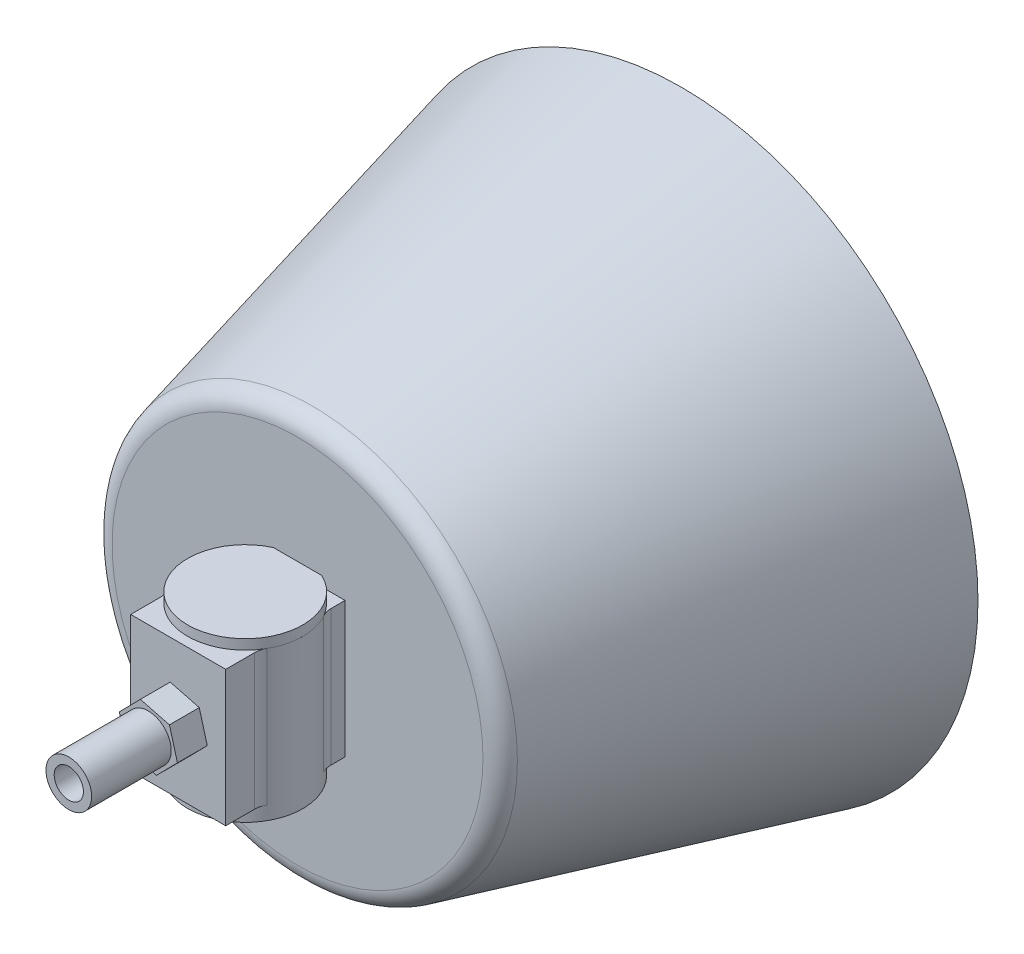
ISO-10303-21;
HEADER;
FILE_DESCRIPTION(('STEP AP214'),'2;1');
FILE_NAME('part.step','',(''),(''),'','','');
FILE_SCHEMA(('AUTOMOTIVE_DESIGN { 1 0 10303 214 1 1 1 1 }'));
ENDSEC;
DATA;
#1=APPLICATION_CONTEXT('core data for automotive mechanical design processes');
#2=APPLICATION_PROTOCOL_DEFINITION('international standard','automotive_design',2000,#1);
#3=PRODUCT_CONTEXT('',#1,'mechanical');
#4=PRODUCT('Part','Part','',(#3));
#5=PRODUCT_RELATED_PRODUCT_CATEGORY('part','',(#4));
#6=PRODUCT_DEFINITION_FORMATION('','',#4);
#7=PRODUCT_DEFINITION_CONTEXT('part definition',#1,'design');
#8=PRODUCT_DEFINITION('design','',#6,#7);
#9=PRODUCT_DEFINITION_SHAPE('','',#8);
#10=(LENGTH_UNIT() NAMED_UNIT(*) SI_UNIT(.MILLI.,.METRE.));
#11=(NAMED_UNIT(*) PLANE_ANGLE_UNIT() SI_UNIT($,.RADIAN.));
#12=(NAMED_UNIT(*) SI_UNIT($,.STERADIAN.) SOLID_ANGLE_UNIT());
#13=UNCERTAINTY_MEASURE_WITH_UNIT(LENGTH_MEASURE(1.E-05),#10,'distance_accuracy_value','');
#14=(GEOMETRIC_REPRESENTATION_CONTEXT(3) GLOBAL_UNCERTAINTY_ASSIGNED_CONTEXT((#13)) GLOBAL_UNIT_ASSIGNED_CONTEXT((#10,
#11,#12)) REPRESENTATION_CONTEXT('',''));
#15=CARTESIAN_POINT('',(0.,0.,0.));
#16=DIRECTION('',(0.,0.,1.));
#17=DIRECTION('',(1.,0.,0.));
#18=AXIS2_PLACEMENT_3D('',#15,#16,#17);
#19=CARTESIAN_POINT('',(0.,0.,15.24));
#20=DIRECTION('',(0.,0.,-1.));
#21=DIRECTION('',(-1.,0.,0.));
#22=AXIS2_PLACEMENT_3D('',#19,#20,#21);
#23=PLANE('',#22);
#24=DIRECTION('',(0.,1.,0.));
#25=VECTOR('',#24,1.);
#26=CARTESIAN_POINT('',(6.06977742119597,-8.6564533971476,15.24));
#27=LINE('',#26,#25);
#28=CARTESIAN_POINT('',(6.06977742119597,-8.6564533971476,15.24));
#29=VERTEX_POINT('',#28);
#30=CARTESIAN_POINT('',(6.06977742119597,8.6564533971476,15.24));
#31=VERTEX_POINT('',#30);
#32=EDGE_CURVE('E259',#29,#31,#27,.T.);
#33=ORIENTED_EDGE('',*,*,#32,.T.);
#34=DIRECTION('',(-1.,0.,0.));
#35=VECTOR('',#34,1.);
#36=CARTESIAN_POINT('',(-6.06977742119597,8.6564533971476,15.24));
#37=LINE('',#36,#35);
#38=CARTESIAN_POINT('',(-6.06977742119597,8.6564533971476,15.24));
#39=VERTEX_POINT('',#38);
#40=EDGE_CURVE('E262',#31,#39,#37,.T.);
#41=ORIENTED_EDGE('',*,*,#40,.T.);
#42=DIRECTION('',(0.,-1.,0.));
#43=VECTOR('',#42,1.);
#44=CARTESIAN_POINT('',(-6.06977742119597,-8.6564533971476,15.24));
#45=LINE('',#44,#43);
#46=CARTESIAN_POINT('',(-6.06977742119597,-8.6564533971476,15.24));
#47=VERTEX_POINT('',#46);
#48=EDGE_CURVE('E265',#39,#47,#45,.T.);
#49=ORIENTED_EDGE('',*,*,#48,.T.);
#50=DIRECTION('',(1.,0.,0.));
#51=VECTOR('',#50,1.);
#52=CARTESIAN_POINT('',(-6.06977742119597,-8.6564533971476,15.24));
#53=LINE('',#52,#51);
#54=EDGE_CURVE('E267',#47,#29,#53,.T.);
#55=ORIENTED_EDGE('',*,*,#54,.T.);
#56=EDGE_LOOP('',(#33,#41,#49,#55));
#57=FACE_BOUND('',#56,.T.);
#58=DIRECTION('',(0.96799318857098,-0.250976466785608,0.));
#59=VECTOR('',#58,1.);
#60=CARTESIAN_POINT('',(-2.68910813073288,-2.73308585679068,15.24));
#61=LINE('',#60,#59);
#62=CARTESIAN_POINT('',(-2.68910813073288,-2.73308585679068,15.24));
#63=VERTEX_POINT('',#62);
#64=CARTESIAN_POINT('',(1.02236771733825,-3.6953788831333,15.24));
#65=VERTEX_POINT('',#64);
#66=EDGE_CURVE('E216',#63,#65,#61,.T.);
#67=ORIENTED_EDGE('',*,*,#66,.F.);
#68=DIRECTION('',(0.266644598297093,-0.963794925385573,0.));
#69=VECTOR('',#68,1.);
#70=CARTESIAN_POINT('',(-3.71147584807113,0.962293026342617,15.24));
#71=LINE('',#70,#69);
#72=CARTESIAN_POINT('',(-3.71147584807113,0.962293026342617,15.24));
#73=VERTEX_POINT('',#72);
#74=EDGE_CURVE('E213',#73,#63,#71,.T.);
#75=ORIENTED_EDGE('',*,*,#74,.F.);
#76=DIRECTION('',(-0.701348590273887,-0.712818458599966,0.));
#77=VECTOR('',#76,1.);
#78=CARTESIAN_POINT('',(-1.02236771733825,3.6953788831333,15.24));
#79=LINE('',#78,#77);
#80=CARTESIAN_POINT('',(-1.02236771733825,3.6953788831333,15.24));
#81=VERTEX_POINT('',#80);
#82=EDGE_CURVE('E812',#81,#73,#79,.T.);
#83=ORIENTED_EDGE('',*,*,#82,.F.);
#84=DIRECTION('',(-0.96799318857098,0.250976466785607,0.));
#85=VECTOR('',#84,1.);
#86=CARTESIAN_POINT('',(2.68910813073288,2.73308585679069,15.24));
#87=LINE('',#86,#85);
#88=CARTESIAN_POINT('',(2.68910813073288,2.73308585679069,15.24));
#89=VERTEX_POINT('',#88);
#90=EDGE_CURVE('E827',#89,#81,#87,.T.);
#91=ORIENTED_EDGE('',*,*,#90,.F.);
#92=DIRECTION('',(-0.266644598297093,0.963794925385573,0.));
#93=VECTOR('',#92,1.);
#94=CARTESIAN_POINT('',(3.71147584807113,-0.962293026342616,15.24));
#95=LINE('',#94,#93);
#96=CARTESIAN_POINT('',(3.71147584807113,-0.962293026342616,15.24));
#97=VERTEX_POINT('',#96);
#98=EDGE_CURVE('E830',#97,#89,#95,.T.);
#99=ORIENTED_EDGE('',*,*,#98,.F.);
#100=DIRECTION('',(0.701348590273887,0.712818458599966,0.));
#101=VECTOR('',#100,1.);
#102=CARTESIAN_POINT('',(1.02236771733825,-3.6953788831333,15.24));
#103=LINE('',#102,#101);
#104=EDGE_CURVE('E831',#65,#97,#103,.T.);
#105=ORIENTED_EDGE('',*,*,#104,.F.);
#106=EDGE_LOOP('',(#67,#75,#83,#91,#99,#105));
#107=FACE_BOUND('',#106,.T.);
#108=ADVANCED_FACE('F32',(#57,#107),#23,.F.);
#109=CARTESIAN_POINT('',(0.,0.,0.));
#110=DIRECTION('',(0.,0.,1.));
#111=DIRECTION('',(1.,0.,0.));
#112=AXIS2_PLACEMENT_3D('',#109,#110,#111);
#113=PLANE('',#112);
#114=CARTESIAN_POINT('',(0.,0.,0.));
#115=DIRECTION('',(0.,0.,1.));
#116=DIRECTION('',(1.,0.,0.));
#117=AXIS2_PLACEMENT_3D('',#114,#115,#116);
#118=CIRCLE('',#117,23.6835282118406);
#119=CARTESIAN_POINT('',(23.6835282118406,0.,0.));
#120=VERTEX_POINT('',#119);
#121=EDGE_CURVE('E317',#120,#120,#118,.T.);
#122=ORIENTED_EDGE('',*,*,#121,.T.);
#123=EDGE_LOOP('',(#122));
#124=FACE_BOUND('',#123,.T.);
#125=DIRECTION('',(1.,0.,0.));
#126=VECTOR('',#125,1.);
#127=CARTESIAN_POINT('',(-6.06977742119597,-8.6564533971476,0.));
#128=LINE('',#127,#126);
#129=CARTESIAN_POINT('',(3.0674275777897,-8.6564533971476,0.));
#130=VERTEX_POINT('',#129);
#131=CARTESIAN_POINT('',(6.06977742119597,-8.6564533971476,0.));
#132=VERTEX_POINT('',#131);
#133=EDGE_CURVE('E279',#130,#132,#128,.T.);
#134=ORIENTED_EDGE('',*,*,#133,.F.);
#135=DIRECTION('',(0.,1.,0.));
#136=VECTOR('',#135,1.);
#137=CARTESIAN_POINT('',(3.0674275777897,-10.3935466028524,0.));
#138=LINE('',#137,#136);
#139=CARTESIAN_POINT('',(3.0674275777897,-10.3935466028524,0.));
#140=VERTEX_POINT('',#139);
#141=EDGE_CURVE('E240',#130,#140,#138,.F.);
#142=ORIENTED_EDGE('',*,*,#141,.T.);
#143=DIRECTION('',(1.,0.,0.));
#144=VECTOR('',#143,1.);
#145=CARTESIAN_POINT('',(0.,-10.3935466028524,0.));
#146=LINE('',#145,#144);
#147=CARTESIAN_POINT('',(-3.04606878534649,-10.3935466028524,0.));
#148=VERTEX_POINT('',#147);
#149=EDGE_CURVE('E305',#148,#140,#146,.T.);
#150=ORIENTED_EDGE('',*,*,#149,.F.);
#151=DIRECTION('',(0.,1.,0.));
#152=VECTOR('',#151,1.);
#153=CARTESIAN_POINT('',(-3.04606878534649,-10.3935466028524,0.));
#154=LINE('',#153,#152);
#155=CARTESIAN_POINT('',(-3.04606878534649,-8.6564533971476,0.));
#156=VERTEX_POINT('',#155);
#157=EDGE_CURVE('E242',#148,#156,#154,.T.);
#158=ORIENTED_EDGE('',*,*,#157,.T.);
#159=CARTESIAN_POINT('',(-6.06977742119597,-8.6564533971476,0.));
#160=VERTEX_POINT('',#159);
#161=EDGE_CURVE('E263',#160,#156,#128,.T.);
#162=ORIENTED_EDGE('',*,*,#161,.F.);
#163=DIRECTION('',(0.,-1.,0.));
#164=VECTOR('',#163,1.);
#165=CARTESIAN_POINT('',(-6.06977742119597,-8.6564533971476,0.));
#166=LINE('',#165,#164);
#167=CARTESIAN_POINT('',(-6.06977742119597,8.6564533971476,0.));
#168=VERTEX_POINT('',#167);
#169=EDGE_CURVE('E276',#168,#160,#166,.T.);
#170=ORIENTED_EDGE('',*,*,#169,.F.);
#171=DIRECTION('',(-1.,0.,0.));
#172=VECTOR('',#171,1.);
#173=CARTESIAN_POINT('',(-6.06977742119597,8.6564533971476,0.));
#174=LINE('',#173,#172);
#175=CARTESIAN_POINT('',(-3.07819517740352,8.6564533971476,0.));
#176=VERTEX_POINT('',#175);
#177=EDGE_CURVE('E272',#176,#168,#174,.T.);
#178=ORIENTED_EDGE('',*,*,#177,.F.);
#179=DIRECTION('',(0.,-1.,0.));
#180=VECTOR('',#179,1.);
#181=CARTESIAN_POINT('',(-3.07819517740352,9.9264533971476,0.));
#182=LINE('',#181,#180);
#183=CARTESIAN_POINT('',(-3.07819517740352,9.9264533971476,0.));
#184=VERTEX_POINT('',#183);
#185=EDGE_CURVE('E255',#176,#184,#182,.F.);
#186=ORIENTED_EDGE('',*,*,#185,.T.);
#187=DIRECTION('',(-1.,0.,0.));
#188=VECTOR('',#187,1.);
#189=CARTESIAN_POINT('',(0.,9.9264533971476,0.));
#190=LINE('',#189,#188);
#191=CARTESIAN_POINT('',(3.07819517740352,9.9264533971476,0.));
#192=VERTEX_POINT('',#191);
#193=EDGE_CURVE('E303',#192,#184,#190,.T.);
#194=ORIENTED_EDGE('',*,*,#193,.F.);
#195=DIRECTION('',(0.,-1.,0.));
#196=VECTOR('',#195,1.);
#197=CARTESIAN_POINT('',(3.07819517740352,9.9264533971476,0.));
#198=LINE('',#197,#196);
#199=CARTESIAN_POINT('',(3.07819517740352,8.6564533971476,0.));
#200=VERTEX_POINT('',#199);
#201=EDGE_CURVE('E247',#192,#200,#198,.T.);
#202=ORIENTED_EDGE('',*,*,#201,.T.);
#203=CARTESIAN_POINT('',(6.06977742119597,8.6564533971476,0.));
#204=VERTEX_POINT('',#203);
#205=EDGE_CURVE('E273',#204,#200,#174,.T.);
#206=ORIENTED_EDGE('',*,*,#205,.F.);
#207=DIRECTION('',(0.,1.,0.));
#208=VECTOR('',#207,1.);
#209=CARTESIAN_POINT('',(6.06977742119597,-8.6564533971476,0.));
#210=LINE('',#209,#208);
#211=EDGE_CURVE('E258',#132,#204,#210,.T.);
#212=ORIENTED_EDGE('',*,*,#211,.F.);
#213=EDGE_LOOP('',(#134,#142,#150,#158,#162,#170,#178,#186,#194,#202,#206,#212));
#214=FACE_BOUND('',#213,.T.);
#215=ADVANCED_FACE('F387',(#124,#214),#113,.T.);
#216=CARTESIAN_POINT('',(6.06977742119597,-8.6564533971476,15.24));
#217=DIRECTION('',(-1.,0.,0.));
#218=DIRECTION('',(0.,0.,1.));
#219=AXIS2_PLACEMENT_3D('',#216,#217,#218);
#220=PLANE('',#219);
#221=DIRECTION('',(0.,0.,-1.));
#222=VECTOR('',#221,1.);
#223=CARTESIAN_POINT('',(6.06977742119597,-8.6564533971476,15.24));
#224=LINE('',#223,#222);
#225=CARTESIAN_POINT('',(6.06977742119597,-8.6564533971476,11.5507942324968));
#226=VERTEX_POINT('',#225);
#227=EDGE_CURVE('E282',#29,#226,#224,.T.);
#228=ORIENTED_EDGE('',*,*,#227,.T.);
#229=DIRECTION('',(0.,-1.,0.));
#230=VECTOR('',#229,1.);
#231=CARTESIAN_POINT('',(6.06977742119597,8.65645339714759,11.5507942324968));
#232=LINE('',#231,#230);
#233=CARTESIAN_POINT('',(6.06977742119597,8.6564533971476,11.5507942324968));
#234=VERTEX_POINT('',#233);
#235=EDGE_CURVE('E337',#226,#234,#232,.F.);
#236=ORIENTED_EDGE('',*,*,#235,.T.);
#237=DIRECTION('',(0.,0.,-1.));
#238=VECTOR('',#237,1.);
#239=CARTESIAN_POINT('',(6.06977742119597,8.6564533971476,15.24));
#240=LINE('',#239,#238);
#241=EDGE_CURVE('E294',#31,#234,#240,.T.);
#242=ORIENTED_EDGE('',*,*,#241,.F.);
#243=ORIENTED_EDGE('',*,*,#32,.F.);
#244=EDGE_LOOP('',(#228,#236,#242,#243));
#245=FACE_BOUND('',#244,.T.);
#246=ADVANCED_FACE('F393',(#245),#220,.F.);
#247=CARTESIAN_POINT('',(6.06977742119597,8.6564533971476,1.80436508766875));
#248=VERTEX_POINT('',#247);
#249=EDGE_CURVE('E293',#248,#204,#240,.T.);
#250=ORIENTED_EDGE('',*,*,#249,.F.);
#251=DIRECTION('',(0.,-1.,0.));
#252=VECTOR('',#251,1.);
#253=CARTESIAN_POINT('',(6.06977742119597,-8.6564533971476,1.80436508766875));
#254=LINE('',#253,#252);
#255=CARTESIAN_POINT('',(6.06977742119597,-8.6564533971476,1.80436508766875));
#256=VERTEX_POINT('',#255);
#257=EDGE_CURVE('E335',#248,#256,#254,.T.);
#258=ORIENTED_EDGE('',*,*,#257,.T.);
#259=EDGE_CURVE('E269',#256,#132,#224,.T.);
#260=ORIENTED_EDGE('',*,*,#259,.T.);
#261=ORIENTED_EDGE('',*,*,#211,.T.);
#262=EDGE_LOOP('',(#250,#258,#260,#261));
#263=FACE_BOUND('',#262,.T.);
#264=ADVANCED_FACE('F413',(#263),#220,.F.);
#265=CARTESIAN_POINT('',(-6.06977742119597,-8.6564533971476,15.24));
#266=DIRECTION('',(1.,0.,0.));
#267=DIRECTION('',(0.,0.,-1.));
#268=AXIS2_PLACEMENT_3D('',#265,#266,#267);
#269=PLANE('',#268);
#270=DIRECTION('',(0.,0.,-1.));
#271=VECTOR('',#270,1.);
#272=CARTESIAN_POINT('',(-6.06977742119597,-8.6564533971476,15.24));
#273=LINE('',#272,#271);
#274=CARTESIAN_POINT('',(-6.06977742119597,-8.6564533971476,1.84224809224326));
#275=VERTEX_POINT('',#274);
#276=EDGE_CURVE('E285',#275,#160,#273,.T.);
#277=ORIENTED_EDGE('',*,*,#276,.F.);
#278=DIRECTION('',(0.,-1.,0.));
#279=VECTOR('',#278,1.);
#280=CARTESIAN_POINT('',(-6.06977742119597,8.65645339714759,1.84224809224326));
#281=LINE('',#280,#279);
#282=CARTESIAN_POINT('',(-6.06977742119597,8.6564533971476,1.84224809224326));
#283=VERTEX_POINT('',#282);
#284=EDGE_CURVE('E341',#275,#283,#281,.F.);
#285=ORIENTED_EDGE('',*,*,#284,.T.);
#286=DIRECTION('',(0.,0.,-1.));
#287=VECTOR('',#286,1.);
#288=CARTESIAN_POINT('',(-6.06977742119597,8.6564533971476,15.24));
#289=LINE('',#288,#287);
#290=EDGE_CURVE('E289',#283,#168,#289,.T.);
#291=ORIENTED_EDGE('',*,*,#290,.T.);
#292=ORIENTED_EDGE('',*,*,#169,.T.);
#293=EDGE_LOOP('',(#277,#285,#291,#292));
#294=FACE_BOUND('',#293,.T.);
#295=ADVANCED_FACE('F409',(#294),#269,.F.);
#296=CARTESIAN_POINT('',(-6.06977742119597,8.6564533971476,11.5129112279223));
#297=VERTEX_POINT('',#296);
#298=EDGE_CURVE('E290',#39,#297,#289,.T.);
#299=ORIENTED_EDGE('',*,*,#298,.T.);
#300=DIRECTION('',(0.,-1.,0.));
#301=VECTOR('',#300,1.);
#302=CARTESIAN_POINT('',(-6.06977742119597,-8.6564533971476,11.5129112279223));
#303=LINE('',#302,#301);
#304=CARTESIAN_POINT('',(-6.06977742119597,-8.6564533971476,11.5129112279223));
#305=VERTEX_POINT('',#304);
#306=EDGE_CURVE('E348',#297,#305,#303,.T.);
#307=ORIENTED_EDGE('',*,*,#306,.T.);
#308=EDGE_CURVE('E286',#47,#305,#273,.T.);
#309=ORIENTED_EDGE('',*,*,#308,.F.);
#310=ORIENTED_EDGE('',*,*,#48,.F.);
#311=EDGE_LOOP('',(#299,#307,#309,#310));
#312=FACE_BOUND('',#311,.T.);
#313=ADVANCED_FACE('F412',(#312),#269,.F.);
#314=CARTESIAN_POINT('',(-6.06977742119597,-8.6564533971476,15.24));
#315=DIRECTION('',(0.,1.,0.));
#316=DIRECTION('',(0.,0.,1.));
#317=AXIS2_PLACEMENT_3D('',#314,#315,#316);
#318=PLANE('',#317);
#319=CARTESIAN_POINT('',(0.0106793962216019,-8.6564533971476,6.67757966008276));
#320=DIRECTION('',(0.,1.,0.));
#321=DIRECTION('',(0.,0.,1.));
#322=AXIS2_PLACEMENT_3D('',#319,#320,#321);
#323=CIRCLE('',#322,7.34396211606997);
#324=CARTESIAN_POINT('',(-6.39447549479129,-8.6564533971476,3.0848410967575));
#325=VERTEX_POINT('',#324);
#326=EDGE_CURVE('E239',#325,#156,#323,.F.);
#327=ORIENTED_EDGE('',*,*,#326,.F.);
#328=CARTESIAN_POINT('',(-8.60977742119597,-8.6564533971476,1.84224809224326));
#329=DIRECTION('',(0.,1.,0.));
#330=DIRECTION('',(0.,0.,1.));
#331=AXIS2_PLACEMENT_3D('',#328,#329,#330);
#332=CIRCLE('',#331,2.54);
#333=EDGE_CURVE('E360',#325,#275,#332,.T.);
#334=ORIENTED_EDGE('',*,*,#333,.T.);
#335=ORIENTED_EDGE('',*,*,#276,.T.);
#336=ORIENTED_EDGE('',*,*,#161,.T.);
#337=EDGE_LOOP('',(#327,#334,#335,#336));
#338=FACE_BOUND('',#337,.T.);
#339=ADVANCED_FACE('F407',(#338),#318,.F.);
#340=CARTESIAN_POINT('',(6.39996431922917,-8.6564533971476,3.05669334111346));
#341=VERTEX_POINT('',#340);
#342=EDGE_CURVE('E238',#130,#341,#323,.F.);
#343=ORIENTED_EDGE('',*,*,#342,.F.);
#344=ORIENTED_EDGE('',*,*,#133,.T.);
#345=ORIENTED_EDGE('',*,*,#259,.F.);
#346=CARTESIAN_POINT('',(8.60977742119597,-8.6564533971476,1.80436508766875));
#347=DIRECTION('',(0.,1.,0.));
#348=DIRECTION('',(0.,0.,1.));
#349=AXIS2_PLACEMENT_3D('',#346,#347,#348);
#350=CIRCLE('',#349,2.54);
#351=EDGE_CURVE('E352',#256,#341,#350,.T.);
#352=ORIENTED_EDGE('',*,*,#351,.T.);
#353=EDGE_LOOP('',(#343,#344,#345,#352));
#354=FACE_BOUND('',#353,.T.);
#355=ADVANCED_FACE('F408',(#354),#318,.F.);
#356=CARTESIAN_POINT('',(0.,8.6564533971476,6.67971339190476));
#357=DIRECTION('',(0.,1.,0.));
#358=DIRECTION('',(0.,0.,1.));
#359=AXIS2_PLACEMENT_3D('',#356,#357,#358);
#360=PLANE('',#359);
#361=CARTESIAN_POINT('',(0.0106793962216019,8.6564533971476,6.67757966008276));
#362=DIRECTION('',(0.,-1.,0.));
#363=DIRECTION('',(0.,0.,-1.));
#364=AXIS2_PLACEMENT_3D('',#361,#362,#363);
#365=CIRCLE('',#364,7.34396211606997);
#366=CARTESIAN_POINT('',(6.39996431922917,8.6564533971476,3.05669334111346));
#367=VERTEX_POINT('',#366);
#368=CARTESIAN_POINT('',(7.21230507816637,8.6564533971476,5.23870263287561));
#369=VERTEX_POINT('',#368);
#370=EDGE_CURVE('E233',#367,#369,#365,.T.);
#371=ORIENTED_EDGE('',*,*,#370,.F.);
#372=CARTESIAN_POINT('',(8.60977742119597,8.6564533971476,1.80436508766875));
#373=DIRECTION('',(0.,1.,0.));
#374=DIRECTION('',(0.,0.,1.));
#375=AXIS2_PLACEMENT_3D('',#372,#373,#374);
#376=CIRCLE('',#375,2.54);
#377=CARTESIAN_POINT('',(6.37749897672294,8.6564533971476,3.01619549921201));
#378=VERTEX_POINT('',#377);
#379=EDGE_CURVE('E332',#367,#378,#376,.F.);
#380=ORIENTED_EDGE('',*,*,#379,.T.);
#381=CARTESIAN_POINT('',(0.,8.6564533971476,6.67971339190476));
#382=DIRECTION('',(0.,1.,0.));
#383=DIRECTION('',(0.,0.,1.));
#384=AXIS2_PLACEMENT_3D('',#381,#382,#383);
#385=CIRCLE('',#384,7.35485258507484);
#386=EDGE_CURVE('E250',#369,#378,#385,.T.);
#387=ORIENTED_EDGE('',*,*,#386,.F.);
#388=EDGE_LOOP('',(#371,#380,#387));
#389=FACE_BOUND('',#388,.T.);
#390=ADVANCED_FACE('F505',(#389),#360,.F.);
#391=CARTESIAN_POINT('',(-6.06977742119597,8.6564533971476,15.24));
#392=DIRECTION('',(0.,-1.,0.));
#393=DIRECTION('',(0.,0.,-1.));
#394=AXIS2_PLACEMENT_3D('',#391,#392,#393);
#395=PLANE('',#394);
#396=CARTESIAN_POINT('',(-6.27618594874521,8.6564533971476,2.84521909865626));
#397=VERTEX_POINT('',#396);
#398=EDGE_CURVE('E506',#176,#397,#385,.T.);
#399=ORIENTED_EDGE('',*,*,#398,.F.);
#400=ORIENTED_EDGE('',*,*,#177,.T.);
#401=ORIENTED_EDGE('',*,*,#290,.F.);
#402=CARTESIAN_POINT('',(-8.60977742119597,8.6564533971476,1.84224809224326));
#403=DIRECTION('',(0.,-1.,0.));
#404=DIRECTION('',(0.,0.,-1.));
#405=AXIS2_PLACEMENT_3D('',#402,#403,#404);
#406=CIRCLE('',#405,2.54);
#407=EDGE_CURVE('E362',#283,#397,#406,.T.);
#408=ORIENTED_EDGE('',*,*,#407,.T.);
#409=EDGE_LOOP('',(#399,#400,#401,#408));
#410=FACE_BOUND('',#409,.T.);
#411=ADVANCED_FACE('F419',(#410),#395,.F.);
#412=CARTESIAN_POINT('',(-6.27019404083715,8.6564533971476,10.5239978816938));
#413=VERTEX_POINT('',#412);
#414=CARTESIAN_POINT('',(6.35153846793674,8.6564533971476,10.3880574480169));
#415=VERTEX_POINT('',#414);
#416=EDGE_CURVE('E48',#413,#415,#385,.T.);
#417=ORIENTED_EDGE('',*,*,#416,.F.);
#418=CARTESIAN_POINT('',(-8.60977742119597,8.6564533971476,11.5129112279223));
#419=DIRECTION('',(0.,-1.,0.));
#420=DIRECTION('',(0.,0.,-1.));
#421=AXIS2_PLACEMENT_3D('',#418,#419,#420);
#422=CIRCLE('',#421,2.54);
#423=EDGE_CURVE('E365',#413,#297,#422,.T.);
#424=ORIENTED_EDGE('',*,*,#423,.T.);
#425=ORIENTED_EDGE('',*,*,#298,.F.);
#426=ORIENTED_EDGE('',*,*,#40,.F.);
#427=ORIENTED_EDGE('',*,*,#241,.T.);
#428=CARTESIAN_POINT('',(8.60977742119597,8.6564533971476,11.5507942324968));
#429=DIRECTION('',(0.,-1.,0.));
#430=DIRECTION('',(0.,0.,-1.));
#431=AXIS2_PLACEMENT_3D('',#428,#429,#430);
#432=CIRCLE('',#431,2.54);
#433=EDGE_CURVE('E357',#234,#415,#432,.T.);
#434=ORIENTED_EDGE('',*,*,#433,.T.);
#435=EDGE_LOOP('',(#417,#424,#425,#426,#427,#434));
#436=FACE_BOUND('',#435,.T.);
#437=ADVANCED_FACE('F420',(#436),#395,.F.);
#438=CARTESIAN_POINT('',(0.,0.,-49.0231349771042));
#439=DIRECTION('',(0.,0.,-1.));
#440=DIRECTION('',(-1.,0.,0.));
#441=AXIS2_PLACEMENT_3D('',#438,#439,#440);
#442=CONICAL_SURFACE('',#441,37.87194976772,0.2439685624603);
#443=CARTESIAN_POINT('',(0.,0.,-1.92644887788709));
#444=DIRECTION('',(0.,0.,1.));
#445=DIRECTION('',(1.,0.,0.));
#446=AXIS2_PLACEMENT_3D('',#443,#444,#445);
#447=CIRCLE('',#446,26.1483111679149);
#448=CARTESIAN_POINT('',(26.1483111679149,0.,-1.92644887788709));
#449=VERTEX_POINT('',#448);
#450=EDGE_CURVE('E314',#449,#449,#447,.F.);
#451=ORIENTED_EDGE('',*,*,#450,.T.);
#452=EDGE_LOOP('',(#451));
#453=FACE_BOUND('',#452,.T.);
#454=CARTESIAN_POINT('',(0.,0.,-49.0231349771042));
#455=DIRECTION('',(0.,0.,-1.));
#456=DIRECTION('',(-1.,0.,0.));
#457=AXIS2_PLACEMENT_3D('',#454,#455,#456);
#458=CIRCLE('',#457,37.87194976772);
#459=CARTESIAN_POINT('',(-37.87194976772,0.,-49.0231349771042));
#460=VERTEX_POINT('',#459);
#461=EDGE_CURVE('E300',#460,#460,#458,.T.);
#462=ORIENTED_EDGE('',*,*,#461,.F.);
#463=EDGE_LOOP('',(#462));
#464=FACE_BOUND('',#463,.T.);
#465=ADVANCED_FACE('F434',(#453,#464),#442,.T.);
#466=CARTESIAN_POINT('',(-37.87194976772,0.,-49.0231349771042));
#467=DIRECTION('',(0.,0.,-1.));
#468=DIRECTION('',(-1.,0.,0.));
#469=AXIS2_PLACEMENT_3D('',#466,#467,#468);
#470=PLANE('',#469);
#471=ORIENTED_EDGE('',*,*,#461,.T.);
#472=EDGE_LOOP('',(#471));
#473=FACE_BOUND('',#472,.T.);
#474=CARTESIAN_POINT('',(0.,0.,-49.0231349771042));
#475=DIRECTION('',(0.,0.,-1.));
#476=DIRECTION('',(-1.,0.,0.));
#477=AXIS2_PLACEMENT_3D('',#474,#475,#476);
#478=CIRCLE('',#477,35.3744655715437);
#479=CARTESIAN_POINT('',(-35.3744655715437,0.,-49.0231349771042));
#480=VERTEX_POINT('',#479);
#481=EDGE_CURVE('E297',#480,#480,#478,.T.);
#482=ORIENTED_EDGE('',*,*,#481,.F.);
#483=EDGE_LOOP('',(#482));
#484=FACE_BOUND('',#483,.T.);
#485=ADVANCED_FACE('F430',(#473,#484),#470,.T.);
#486=CARTESIAN_POINT('',(0.,0.,-3.22703553323876));
#487=DIRECTION('',(0.,0.,-1.));
#488=DIRECTION('',(-1.,0.,0.));
#489=AXIS2_PLACEMENT_3D('',#486,#487,#488);
#490=CONICAL_SURFACE('',#489,23.9745781563325,0.2439685624603);
#491=CARTESIAN_POINT('',(0.,0.,-7.07993328901297));
#492=DIRECTION('',(0.,0.,-1.));
#493=DIRECTION('',(-1.,0.,0.));
#494=AXIS2_PLACEMENT_3D('',#491,#492,#493);
#495=CIRCLE('',#494,24.9336685848085);
#496=CARTESIAN_POINT('',(-24.9336685848085,0.,-7.07993328901297));
#497=VERTEX_POINT('',#496);
#498=EDGE_CURVE('E311',#497,#497,#495,.F.);
#499=ORIENTED_EDGE('',*,*,#498,.T.);
#500=EDGE_LOOP('',(#499));
#501=FACE_BOUND('',#500,.T.);
#502=ORIENTED_EDGE('',*,*,#481,.T.);
#503=EDGE_LOOP('',(#502));
#504=FACE_BOUND('',#503,.T.);
#505=ADVANCED_FACE('F426',(#501,#504),#490,.F.);
#506=CARTESIAN_POINT('',(-23.9745781563325,0.,-3.22703553323876));
#507=DIRECTION('',(0.,0.,-1.));
#508=DIRECTION('',(-1.,0.,0.));
#509=AXIS2_PLACEMENT_3D('',#506,#507,#508);
#510=PLANE('',#509);
#511=CARTESIAN_POINT('',(0.,0.,-3.22703553323876));
#512=DIRECTION('',(0.,0.,-1.));
#513=DIRECTION('',(-1.,0.,0.));
#514=AXIS2_PLACEMENT_3D('',#511,#512,#513);
#515=CIRCLE('',#514,4.40660403766936);
#516=CARTESIAN_POINT('',(-4.40660403766936,0.,-3.22703553323876));
#517=VERTEX_POINT('',#516);
#518=EDGE_CURVE('E11',#517,#517,#515,.F.);
#519=ORIENTED_EDGE('',*,*,#518,.T.);
#520=EDGE_LOOP('',(#519));
#521=FACE_BOUND('',#520,.T.);
#522=CARTESIAN_POINT('',(0.,0.,-3.22703553323876));
#523=DIRECTION('',(0.,0.,-1.));
#524=DIRECTION('',(-1.,0.,0.));
#525=AXIS2_PLACEMENT_3D('',#522,#523,#524);
#526=CIRCLE('',#525,20.00410267266);
#527=CARTESIAN_POINT('',(-20.00410267266,0.,-3.22703553323876));
#528=VERTEX_POINT('',#527);
#529=EDGE_CURVE('E308',#528,#528,#526,.T.);
#530=ORIENTED_EDGE('',*,*,#529,.T.);
#531=EDGE_LOOP('',(#530));
#532=FACE_BOUND('',#531,.T.);
#533=ADVANCED_FACE('F417',(#521,#532),#510,.T.);
#534=EDGE_CURVE('E252',#378,#200,#385,.T.);
#535=ORIENTED_EDGE('',*,*,#534,.F.);
#536=CARTESIAN_POINT('',(8.60977742119597,8.6564533971476,1.80436508766875));
#537=DIRECTION('',(0.,-1.,0.));
#538=DIRECTION('',(0.,0.,-1.));
#539=AXIS2_PLACEMENT_3D('',#536,#537,#538);
#540=CIRCLE('',#539,2.54);
#541=EDGE_CURVE('E350',#378,#248,#540,.T.);
#542=ORIENTED_EDGE('',*,*,#541,.T.);
#543=ORIENTED_EDGE('',*,*,#249,.T.);
#544=ORIENTED_EDGE('',*,*,#205,.T.);
#545=EDGE_LOOP('',(#535,#542,#543,#544));
#546=FACE_BOUND('',#545,.T.);
#547=ADVANCED_FACE('F405',(#546),#395,.F.);
#548=CARTESIAN_POINT('',(6.39996431922917,-8.6564533971476,10.2984659790521));
#549=VERTEX_POINT('',#548);
#550=CARTESIAN_POINT('',(-6.39447549479129,-8.6564533971476,10.270318223408));
#551=VERTEX_POINT('',#550);
#552=EDGE_CURVE('E232',#549,#551,#323,.F.);
#553=ORIENTED_EDGE('',*,*,#552,.F.);
#554=CARTESIAN_POINT('',(8.60977742119597,-8.6564533971476,11.5507942324968));
#555=DIRECTION('',(0.,1.,0.));
#556=DIRECTION('',(0.,0.,1.));
#557=AXIS2_PLACEMENT_3D('',#554,#555,#556);
#558=CIRCLE('',#557,2.54);
#559=EDGE_CURVE('E355',#549,#226,#558,.T.);
#560=ORIENTED_EDGE('',*,*,#559,.T.);
#561=ORIENTED_EDGE('',*,*,#227,.F.);
#562=ORIENTED_EDGE('',*,*,#54,.F.);
#563=ORIENTED_EDGE('',*,*,#308,.T.);
#564=CARTESIAN_POINT('',(-8.60977742119597,-8.6564533971476,11.5129112279223));
#565=DIRECTION('',(0.,1.,0.));
#566=DIRECTION('',(0.,0.,1.));
#567=AXIS2_PLACEMENT_3D('',#564,#565,#566);
#568=CIRCLE('',#567,2.54);
#569=EDGE_CURVE('E367',#305,#551,#568,.T.);
#570=ORIENTED_EDGE('',*,*,#569,.T.);
#571=EDGE_LOOP('',(#553,#560,#561,#562,#563,#570));
#572=FACE_BOUND('',#571,.T.);
#573=ADVANCED_FACE('F401',(#572),#318,.F.);
#574=EDGE_CURVE('E248',#415,#369,#385,.T.);
#575=ORIENTED_EDGE('',*,*,#574,.F.);
#576=CARTESIAN_POINT('',(8.60977742119597,8.6564533971476,11.5507942324968));
#577=DIRECTION('',(0.,1.,0.));
#578=DIRECTION('',(0.,0.,1.));
#579=AXIS2_PLACEMENT_3D('',#576,#577,#578);
#580=CIRCLE('',#579,2.54);
#581=CARTESIAN_POINT('',(6.39996431922917,8.6564533971476,10.2984659790521));
#582=VERTEX_POINT('',#581);
#583=EDGE_CURVE('E339',#415,#582,#580,.F.);
#584=ORIENTED_EDGE('',*,*,#583,.T.);
#585=EDGE_CURVE('E236',#369,#582,#365,.T.);
#586=ORIENTED_EDGE('',*,*,#585,.F.);
#587=EDGE_LOOP('',(#575,#584,#586));
#588=FACE_BOUND('',#587,.T.);
#589=ADVANCED_FACE('F404',(#588),#360,.F.);
#590=EDGE_CURVE('E251',#397,#413,#385,.T.);
#591=ORIENTED_EDGE('',*,*,#590,.F.);
#592=CARTESIAN_POINT('',(-8.60977742119597,8.6564533971476,1.84224809224326));
#593=DIRECTION('',(0.,1.,0.));
#594=DIRECTION('',(0.,0.,1.));
#595=AXIS2_PLACEMENT_3D('',#592,#593,#594);
#596=CIRCLE('',#595,2.54);
#597=CARTESIAN_POINT('',(-6.39447549479129,8.6564533971476,3.0848410967575));
#598=VERTEX_POINT('',#597);
#599=EDGE_CURVE('E346',#397,#598,#596,.F.);
#600=ORIENTED_EDGE('',*,*,#599,.T.);
#601=CARTESIAN_POINT('',(-6.39447549479129,8.6564533971476,10.270318223408));
#602=VERTEX_POINT('',#601);
#603=EDGE_CURVE('E228',#602,#598,#365,.T.);
#604=ORIENTED_EDGE('',*,*,#603,.F.);
#605=CARTESIAN_POINT('',(-8.60977742119597,8.6564533971476,11.5129112279223));
#606=DIRECTION('',(0.,1.,0.));
#607=DIRECTION('',(0.,0.,1.));
#608=AXIS2_PLACEMENT_3D('',#605,#606,#607);
#609=CIRCLE('',#608,2.54);
#610=EDGE_CURVE('E343',#602,#413,#609,.F.);
#611=ORIENTED_EDGE('',*,*,#610,.T.);
#612=EDGE_LOOP('',(#591,#600,#604,#611));
#613=FACE_BOUND('',#612,.T.);
#614=ADVANCED_FACE('F482',(#613),#360,.F.);
#615=CARTESIAN_POINT('',(0.,9.9264533971476,6.67971339190476));
#616=DIRECTION('',(0.,-1.,0.));
#617=DIRECTION('',(0.,0.,-1.));
#618=AXIS2_PLACEMENT_3D('',#615,#616,#617);
#619=CYLINDRICAL_SURFACE('',#618,7.35485258507484);
#620=ORIENTED_EDGE('',*,*,#185,.F.);
#621=ORIENTED_EDGE('',*,*,#398,.T.);
#622=ORIENTED_EDGE('',*,*,#590,.T.);
#623=ORIENTED_EDGE('',*,*,#416,.T.);
#624=ORIENTED_EDGE('',*,*,#574,.T.);
#625=ORIENTED_EDGE('',*,*,#386,.T.);
#626=ORIENTED_EDGE('',*,*,#534,.T.);
#627=ORIENTED_EDGE('',*,*,#201,.F.);
#628=CARTESIAN_POINT('',(0.,9.9264533971476,6.67971339190476));
#629=DIRECTION('',(0.,1.,0.));
#630=DIRECTION('',(0.,0.,1.));
#631=AXIS2_PLACEMENT_3D('',#628,#629,#630);
#632=CIRCLE('',#631,7.35485258507484);
#633=EDGE_CURVE('E244',#184,#192,#632,.T.);
#634=ORIENTED_EDGE('',*,*,#633,.F.);
#635=EDGE_LOOP('',(#620,#621,#622,#623,#624,#625,#626,#627,#634));
#636=FACE_BOUND('',#635,.T.);
#637=ADVANCED_FACE('F399',(#636),#619,.T.);
#638=CARTESIAN_POINT('',(0.,9.9264533971476,6.67971339190476));
#639=DIRECTION('',(0.,1.,0.));
#640=DIRECTION('',(0.,0.,1.));
#641=AXIS2_PLACEMENT_3D('',#638,#639,#640);
#642=PLANE('',#641);
#643=ORIENTED_EDGE('',*,*,#633,.T.);
#644=ORIENTED_EDGE('',*,*,#193,.T.);
#645=EDGE_LOOP('',(#643,#644));
#646=FACE_BOUND('',#645,.T.);
#647=ADVANCED_FACE('F523',(#646),#642,.T.);
#648=CARTESIAN_POINT('',(0.0106793962216019,-10.3935466028524,6.67757966008276));
#649=DIRECTION('',(0.,1.,0.));
#650=DIRECTION('',(0.,0.,1.));
#651=AXIS2_PLACEMENT_3D('',#648,#649,#650);
#652=CYLINDRICAL_SURFACE('',#651,7.34396211606997);
#653=ORIENTED_EDGE('',*,*,#342,.T.);
#654=DIRECTION('',(0.,1.,0.));
#655=VECTOR('',#654,1.);
#656=CARTESIAN_POINT('',(6.39996431922917,-10.3935466028524,3.05669334111346));
#657=LINE('',#656,#655);
#658=EDGE_CURVE('E329',#341,#367,#657,.T.);
#659=ORIENTED_EDGE('',*,*,#658,.T.);
#660=ORIENTED_EDGE('',*,*,#370,.T.);
#661=ORIENTED_EDGE('',*,*,#585,.T.);
#662=DIRECTION('',(0.,1.,0.));
#663=VECTOR('',#662,1.);
#664=CARTESIAN_POINT('',(6.39996431922917,-10.3935466028524,10.2984659790521));
#665=LINE('',#664,#663);
#666=EDGE_CURVE('E326',#582,#549,#665,.F.);
#667=ORIENTED_EDGE('',*,*,#666,.T.);
#668=ORIENTED_EDGE('',*,*,#552,.T.);
#669=DIRECTION('',(0.,1.,0.));
#670=VECTOR('',#669,1.);
#671=CARTESIAN_POINT('',(-6.39447549479129,-10.3935466028524,10.270318223408));
#672=LINE('',#671,#670);
#673=EDGE_CURVE('E319',#551,#602,#672,.T.);
#674=ORIENTED_EDGE('',*,*,#673,.T.);
#675=ORIENTED_EDGE('',*,*,#603,.T.);
#676=DIRECTION('',(0.,1.,0.));
#677=VECTOR('',#676,1.);
#678=CARTESIAN_POINT('',(-6.39447549479129,-10.3935466028524,3.0848410967575));
#679=LINE('',#678,#677);
#680=EDGE_CURVE('E323',#598,#325,#679,.F.);
#681=ORIENTED_EDGE('',*,*,#680,.T.);
#682=ORIENTED_EDGE('',*,*,#326,.T.);
#683=ORIENTED_EDGE('',*,*,#157,.F.);
#684=CARTESIAN_POINT('',(0.0106793962216019,-10.3935466028524,6.67757966008276));
#685=DIRECTION('',(0.,-1.,0.));
#686=DIRECTION('',(0.,0.,-1.));
#687=AXIS2_PLACEMENT_3D('',#684,#685,#686);
#688=CIRCLE('',#687,7.34396211606997);
#689=EDGE_CURVE('E229',#140,#148,#688,.T.);
#690=ORIENTED_EDGE('',*,*,#689,.F.);
#691=ORIENTED_EDGE('',*,*,#141,.F.);
#692=EDGE_LOOP('',(#653,#659,#660,#661,#667,#668,#674,#675,#681,#682,#683,#690,#691));
#693=FACE_BOUND('',#692,.T.);
#694=ADVANCED_FACE('F480',(#693),#652,.T.);
#695=CARTESIAN_POINT('',(0.0106793962216019,-10.3935466028524,6.67757966008276));
#696=DIRECTION('',(0.,-1.,0.));
#697=DIRECTION('',(0.,0.,-1.));
#698=AXIS2_PLACEMENT_3D('',#695,#696,#697);
#699=PLANE('',#698);
#700=ORIENTED_EDGE('',*,*,#689,.T.);
#701=ORIENTED_EDGE('',*,*,#149,.T.);
#702=EDGE_LOOP('',(#700,#701));
#703=FACE_BOUND('',#702,.T.);
#704=ADVANCED_FACE('F443',(#703),#699,.T.);
#705=CARTESIAN_POINT('',(0.,0.,-8.30703553323876));
#706=DIRECTION('',(0.,0.,-1.));
#707=DIRECTION('',(-1.,0.,0.));
#708=AXIS2_PLACEMENT_3D('',#705,#706,#707);
#709=TOROIDAL_SURFACE('',#708,20.00410267266,5.08);
#710=ORIENTED_EDGE('',*,*,#498,.F.);
#711=EDGE_LOOP('',(#710));
#712=FACE_BOUND('',#711,.T.);
#713=ORIENTED_EDGE('',*,*,#529,.F.);
#714=EDGE_LOOP('',(#713));
#715=FACE_BOUND('',#714,.T.);
#716=ADVANCED_FACE('F439',(#712,#715),#709,.F.);
#717=CARTESIAN_POINT('',(0.,0.,-2.54));
#718=DIRECTION('',(0.,0.,1.));
#719=DIRECTION('',(1.,0.,0.));
#720=AXIS2_PLACEMENT_3D('',#717,#718,#719);
#721=TOROIDAL_SURFACE('',#720,23.6835282118406,2.54);
#722=ORIENTED_EDGE('',*,*,#121,.F.);
#723=EDGE_LOOP('',(#722));
#724=FACE_BOUND('',#723,.T.);
#725=ORIENTED_EDGE('',*,*,#450,.F.);
#726=EDGE_LOOP('',(#725));
#727=FACE_BOUND('',#726,.T.);
#728=ADVANCED_FACE('F442',(#724,#727),#721,.T.);
#729=CARTESIAN_POINT('',(-2.68910813073288,-2.73308585679068,19.05));
#730=DIRECTION('',(0.250976466785608,0.96799318857098,0.));
#731=DIRECTION('',(-0.96799318857098,0.250976466785608,0.));
#732=AXIS2_PLACEMENT_3D('',#729,#730,#731);
#733=PLANE('',#732);
#734=ORIENTED_EDGE('',*,*,#66,.T.);
#735=DIRECTION('',(0.,0.,-1.));
#736=VECTOR('',#735,1.);
#737=CARTESIAN_POINT('',(1.02236771733825,-3.6953788831333,19.05));
#738=LINE('',#737,#736);
#739=CARTESIAN_POINT('',(1.02236771733825,-3.6953788831333,19.05));
#740=VERTEX_POINT('',#739);
#741=EDGE_CURVE('E197',#740,#65,#738,.T.);
#742=ORIENTED_EDGE('',*,*,#741,.F.);
#743=DIRECTION('',(0.96799318857098,-0.250976466785608,0.));
#744=VECTOR('',#743,1.);
#745=CARTESIAN_POINT('',(-2.68910813073288,-2.73308585679068,19.05));
#746=LINE('',#745,#744);
#747=CARTESIAN_POINT('',(-2.68910813073288,-2.73308585679068,19.05));
#748=VERTEX_POINT('',#747);
#749=EDGE_CURVE('E204',#748,#740,#746,.T.);
#750=ORIENTED_EDGE('',*,*,#749,.F.);
#751=DIRECTION('',(0.,0.,-1.));
#752=VECTOR('',#751,1.);
#753=CARTESIAN_POINT('',(-2.68910813073288,-2.73308585679068,19.05));
#754=LINE('',#753,#752);
#755=EDGE_CURVE('E808',#748,#63,#754,.T.);
#756=ORIENTED_EDGE('',*,*,#755,.T.);
#757=EDGE_LOOP('',(#734,#742,#750,#756));
#758=FACE_BOUND('',#757,.T.);
#759=ADVANCED_FACE('F215',(#758),#733,.F.);
#760=CARTESIAN_POINT('',(1.02236771733825,-3.6953788831333,19.05));
#761=DIRECTION('',(-0.712818458599966,0.701348590273887,0.));
#762=DIRECTION('',(-0.701348590273887,-0.712818458599966,0.));
#763=AXIS2_PLACEMENT_3D('',#760,#761,#762);
#764=PLANE('',#763);
#765=ORIENTED_EDGE('',*,*,#104,.T.);
#766=DIRECTION('',(0.,0.,-1.));
#767=VECTOR('',#766,1.);
#768=CARTESIAN_POINT('',(3.71147584807113,-0.962293026342616,19.05));
#769=LINE('',#768,#767);
#770=CARTESIAN_POINT('',(3.71147584807113,-0.962293026342616,19.05));
#771=VERTEX_POINT('',#770);
#772=EDGE_CURVE('E200',#771,#97,#769,.T.);
#773=ORIENTED_EDGE('',*,*,#772,.F.);
#774=DIRECTION('',(0.701348590273887,0.712818458599966,0.));
#775=VECTOR('',#774,1.);
#776=CARTESIAN_POINT('',(1.02236771733825,-3.6953788831333,19.05));
#777=LINE('',#776,#775);
#778=EDGE_CURVE('E192',#740,#771,#777,.T.);
#779=ORIENTED_EDGE('',*,*,#778,.F.);
#780=ORIENTED_EDGE('',*,*,#741,.T.);
#781=EDGE_LOOP('',(#765,#773,#779,#780));
#782=FACE_BOUND('',#781,.T.);
#783=ADVANCED_FACE('F195',(#782),#764,.F.);
#784=CARTESIAN_POINT('',(3.71147584807113,-0.962293026342616,19.05));
#785=DIRECTION('',(-0.963794925385573,-0.266644598297093,0.));
#786=DIRECTION('',(0.266644598297093,-0.963794925385573,0.));
#787=AXIS2_PLACEMENT_3D('',#784,#785,#786);
#788=PLANE('',#787);
#789=ORIENTED_EDGE('',*,*,#98,.T.);
#790=DIRECTION('',(0.,0.,-1.));
#791=VECTOR('',#790,1.);
#792=CARTESIAN_POINT('',(2.68910813073288,2.73308585679069,19.05));
#793=LINE('',#792,#791);
#794=CARTESIAN_POINT('',(2.68910813073288,2.73308585679069,19.05));
#795=VERTEX_POINT('',#794);
#796=EDGE_CURVE('E222',#795,#89,#793,.T.);
#797=ORIENTED_EDGE('',*,*,#796,.F.);
#798=DIRECTION('',(-0.266644598297093,0.963794925385573,0.));
#799=VECTOR('',#798,1.);
#800=CARTESIAN_POINT('',(3.71147584807113,-0.962293026342616,19.05));
#801=LINE('',#800,#799);
#802=EDGE_CURVE('E203',#771,#795,#801,.T.);
#803=ORIENTED_EDGE('',*,*,#802,.F.);
#804=ORIENTED_EDGE('',*,*,#772,.T.);
#805=EDGE_LOOP('',(#789,#797,#803,#804));
#806=FACE_BOUND('',#805,.T.);
#807=ADVANCED_FACE('F609',(#806),#788,.F.);
#808=CARTESIAN_POINT('',(2.68910813073288,2.73308585679069,19.05));
#809=DIRECTION('',(-0.250976466785607,-0.96799318857098,0.));
#810=DIRECTION('',(0.96799318857098,-0.250976466785607,0.));
#811=AXIS2_PLACEMENT_3D('',#808,#809,#810);
#812=PLANE('',#811);
#813=ORIENTED_EDGE('',*,*,#90,.T.);
#814=DIRECTION('',(0.,0.,-1.));
#815=VECTOR('',#814,1.);
#816=CARTESIAN_POINT('',(-1.02236771733825,3.6953788831333,19.05));
#817=LINE('',#816,#815);
#818=CARTESIAN_POINT('',(-1.02236771733825,3.6953788831333,19.05));
#819=VERTEX_POINT('',#818);
#820=EDGE_CURVE('E815',#819,#81,#817,.T.);
#821=ORIENTED_EDGE('',*,*,#820,.F.);
#822=DIRECTION('',(-0.96799318857098,0.250976466785607,0.));
#823=VECTOR('',#822,1.);
#824=CARTESIAN_POINT('',(2.68910813073288,2.73308585679069,19.05));
#825=LINE('',#824,#823);
#826=EDGE_CURVE('E828',#795,#819,#825,.T.);
#827=ORIENTED_EDGE('',*,*,#826,.F.);
#828=ORIENTED_EDGE('',*,*,#796,.T.);
#829=EDGE_LOOP('',(#813,#821,#827,#828));
#830=FACE_BOUND('',#829,.T.);
#831=ADVANCED_FACE('F618',(#830),#812,.F.);
#832=CARTESIAN_POINT('',(-1.02236771733825,3.6953788831333,19.05));
#833=DIRECTION('',(0.712818458599966,-0.701348590273887,0.));
#834=DIRECTION('',(0.701348590273887,0.712818458599966,0.));
#835=AXIS2_PLACEMENT_3D('',#832,#833,#834);
#836=PLANE('',#835);
#837=ORIENTED_EDGE('',*,*,#82,.T.);
#838=DIRECTION('',(0.,0.,-1.));
#839=VECTOR('',#838,1.);
#840=CARTESIAN_POINT('',(-3.71147584807113,0.962293026342617,19.05));
#841=LINE('',#840,#839);
#842=CARTESIAN_POINT('',(-3.71147584807113,0.962293026342617,19.05));
#843=VERTEX_POINT('',#842);
#844=EDGE_CURVE('E810',#843,#73,#841,.T.);
#845=ORIENTED_EDGE('',*,*,#844,.F.);
#846=DIRECTION('',(-0.701348590273887,-0.712818458599966,0.));
#847=VECTOR('',#846,1.);
#848=CARTESIAN_POINT('',(-1.02236771733825,3.6953788831333,19.05));
#849=LINE('',#848,#847);
#850=EDGE_CURVE('E817',#819,#843,#849,.T.);
#851=ORIENTED_EDGE('',*,*,#850,.F.);
#852=ORIENTED_EDGE('',*,*,#820,.T.);
#853=EDGE_LOOP('',(#837,#845,#851,#852));
#854=FACE_BOUND('',#853,.T.);
#855=ADVANCED_FACE('F628',(#854),#836,.F.);
#856=CARTESIAN_POINT('',(-3.71147584807113,0.962293026342617,19.05));
#857=DIRECTION('',(0.963794925385573,0.266644598297093,0.));
#858=DIRECTION('',(-0.266644598297093,0.963794925385573,0.));
#859=AXIS2_PLACEMENT_3D('',#856,#857,#858);
#860=PLANE('',#859);
#861=ORIENTED_EDGE('',*,*,#74,.T.);
#862=ORIENTED_EDGE('',*,*,#755,.F.);
#863=DIRECTION('',(0.266644598297093,-0.963794925385573,0.));
#864=VECTOR('',#863,1.);
#865=CARTESIAN_POINT('',(-3.71147584807113,0.962293026342617,19.05));
#866=LINE('',#865,#864);
#867=EDGE_CURVE('E209',#843,#748,#866,.T.);
#868=ORIENTED_EDGE('',*,*,#867,.F.);
#869=ORIENTED_EDGE('',*,*,#844,.T.);
#870=EDGE_LOOP('',(#861,#862,#868,#869));
#871=FACE_BOUND('',#870,.T.);
#872=ADVANCED_FACE('F638',(#871),#860,.F.);
#873=CARTESIAN_POINT('',(0.,0.,19.05));
#874=DIRECTION('',(0.,0.,1.));
#875=DIRECTION('',(1.,0.,0.));
#876=AXIS2_PLACEMENT_3D('',#873,#874,#875);
#877=PLANE('',#876);
#878=CARTESIAN_POINT('',(0.,0.,19.05));
#879=DIRECTION('',(0.,0.,1.));
#880=DIRECTION('',(1.,0.,0.));
#881=AXIS2_PLACEMENT_3D('',#878,#879,#880);
#882=CIRCLE('',#881,2.91776259962605);
#883=CARTESIAN_POINT('',(2.91776259962605,0.,19.05));
#884=VERTEX_POINT('',#883);
#885=EDGE_CURVE('E217',#884,#884,#882,.T.);
#886=ORIENTED_EDGE('',*,*,#885,.F.);
#887=EDGE_LOOP('',(#886));
#888=FACE_BOUND('',#887,.T.);
#889=ORIENTED_EDGE('',*,*,#749,.T.);
#890=ORIENTED_EDGE('',*,*,#778,.T.);
#891=ORIENTED_EDGE('',*,*,#802,.T.);
#892=ORIENTED_EDGE('',*,*,#826,.T.);
#893=ORIENTED_EDGE('',*,*,#850,.T.);
#894=ORIENTED_EDGE('',*,*,#867,.T.);
#895=EDGE_LOOP('',(#889,#890,#891,#892,#893,#894));
#896=FACE_BOUND('',#895,.T.);
#897=ADVANCED_FACE('F207',(#888,#896),#877,.T.);
#898=CARTESIAN_POINT('',(0.,0.,29.21));
#899=DIRECTION('',(0.,0.,1.));
#900=DIRECTION('',(1.,0.,0.));
#901=AXIS2_PLACEMENT_3D('',#898,#899,#900);
#902=PLANE('',#901);
#903=CARTESIAN_POINT('',(0.,0.,29.21));
#904=DIRECTION('',(0.,0.,1.));
#905=DIRECTION('',(1.,0.,0.));
#906=AXIS2_PLACEMENT_3D('',#903,#904,#905);
#907=CIRCLE('',#906,1.86660403766936);
#908=CARTESIAN_POINT('',(1.86660403766936,0.,29.21));
#909=VERTEX_POINT('',#908);
#910=EDGE_CURVE('E370',#909,#909,#907,.T.);
#911=ORIENTED_EDGE('',*,*,#910,.F.);
#912=EDGE_LOOP('',(#911));
#913=FACE_BOUND('',#912,.T.);
#914=CARTESIAN_POINT('',(0.,0.,29.21));
#915=DIRECTION('',(0.,0.,1.));
#916=DIRECTION('',(1.,0.,0.));
#917=AXIS2_PLACEMENT_3D('',#914,#915,#916);
#918=CIRCLE('',#917,2.91776259962605);
#919=CARTESIAN_POINT('',(2.91776259962605,0.,29.21));
#920=VERTEX_POINT('',#919);
#921=EDGE_CURVE('E220',#920,#920,#918,.T.);
#922=ORIENTED_EDGE('',*,*,#921,.T.);
#923=EDGE_LOOP('',(#922));
#924=FACE_BOUND('',#923,.T.);
#925=ADVANCED_FACE('F656',(#913,#924),#902,.T.);
#926=CARTESIAN_POINT('',(0.,0.,29.21));
#927=DIRECTION('',(0.,0.,-1.));
#928=DIRECTION('',(-1.,0.,0.));
#929=AXIS2_PLACEMENT_3D('',#926,#927,#928);
#930=CYLINDRICAL_SURFACE('',#929,2.91776259962605);
#931=ORIENTED_EDGE('',*,*,#885,.T.);
#932=EDGE_LOOP('',(#931));
#933=FACE_BOUND('',#932,.T.);
#934=ORIENTED_EDGE('',*,*,#921,.F.);
#935=EDGE_LOOP('',(#934));
#936=FACE_BOUND('',#935,.T.);
#937=ADVANCED_FACE('F452',(#933,#936),#930,.T.);
#938=CARTESIAN_POINT('',(8.60977742119597,-10.3935466028524,1.80436508766875));
#939=DIRECTION('',(0.,1.,0.));
#940=DIRECTION('',(0.,0.,1.));
#941=AXIS2_PLACEMENT_3D('',#938,#939,#940);
#942=CYLINDRICAL_SURFACE('',#941,2.54);
#943=ORIENTED_EDGE('',*,*,#351,.F.);
#944=ORIENTED_EDGE('',*,*,#257,.F.);
#945=ORIENTED_EDGE('',*,*,#541,.F.);
#946=ORIENTED_EDGE('',*,*,#379,.F.);
#947=ORIENTED_EDGE('',*,*,#658,.F.);
#948=EDGE_LOOP('',(#943,#944,#945,#946,#947));
#949=FACE_BOUND('',#948,.T.);
#950=ADVANCED_FACE('F448',(#949),#942,.F.);
#951=CARTESIAN_POINT('',(8.60977742119597,-10.3935466028524,11.5507942324968));
#952=DIRECTION('',(0.,1.,0.));
#953=DIRECTION('',(0.,0.,1.));
#954=AXIS2_PLACEMENT_3D('',#951,#952,#953);
#955=CYLINDRICAL_SURFACE('',#954,2.54);
#956=ORIENTED_EDGE('',*,*,#433,.F.);
#957=ORIENTED_EDGE('',*,*,#235,.F.);
#958=ORIENTED_EDGE('',*,*,#559,.F.);
#959=ORIENTED_EDGE('',*,*,#666,.F.);
#960=ORIENTED_EDGE('',*,*,#583,.F.);
#961=EDGE_LOOP('',(#956,#957,#958,#959,#960));
#962=FACE_BOUND('',#961,.T.);
#963=ADVANCED_FACE('F451',(#962),#955,.F.);
#964=CARTESIAN_POINT('',(-8.60977742119597,-10.3935466028524,1.84224809224326));
#965=DIRECTION('',(0.,1.,0.));
#966=DIRECTION('',(0.,0.,1.));
#967=AXIS2_PLACEMENT_3D('',#964,#965,#966);
#968=CYLINDRICAL_SURFACE('',#967,2.54);
#969=ORIENTED_EDGE('',*,*,#407,.F.);
#970=ORIENTED_EDGE('',*,*,#284,.F.);
#971=ORIENTED_EDGE('',*,*,#333,.F.);
#972=ORIENTED_EDGE('',*,*,#680,.F.);
#973=ORIENTED_EDGE('',*,*,#599,.F.);
#974=EDGE_LOOP('',(#969,#970,#971,#972,#973));
#975=FACE_BOUND('',#974,.T.);
#976=ADVANCED_FACE('F456',(#975),#968,.F.);
#977=CARTESIAN_POINT('',(-8.60977742119597,-10.3935466028524,11.5129112279223));
#978=DIRECTION('',(0.,1.,0.));
#979=DIRECTION('',(0.,0.,1.));
#980=AXIS2_PLACEMENT_3D('',#977,#978,#979);
#981=CYLINDRICAL_SURFACE('',#980,2.54);
#982=ORIENTED_EDGE('',*,*,#569,.F.);
#983=ORIENTED_EDGE('',*,*,#306,.F.);
#984=ORIENTED_EDGE('',*,*,#423,.F.);
#985=ORIENTED_EDGE('',*,*,#610,.F.);
#986=ORIENTED_EDGE('',*,*,#673,.F.);
#987=EDGE_LOOP('',(#982,#983,#984,#985,#986));
#988=FACE_BOUND('',#987,.T.);
#989=ADVANCED_FACE('F383',(#988),#981,.F.);
#990=CARTESIAN_POINT('',(0.,0.,51.3829644667612));
#991=DIRECTION('',(0.,0.,-1.));
#992=DIRECTION('',(-1.,0.,0.));
#993=AXIS2_PLACEMENT_3D('',#990,#991,#992);
#994=CYLINDRICAL_SURFACE('',#993,1.86660403766936);
#995=CARTESIAN_POINT('',(0.,0.,-0.687035533238761));
#996=DIRECTION('',(0.,0.,-1.));
#997=DIRECTION('',(-1.,0.,0.));
#998=AXIS2_PLACEMENT_3D('',#995,#996,#997);
#999=CIRCLE('',#998,1.86660403766936);
#1000=CARTESIAN_POINT('',(-1.86660403766936,0.,-0.687035533238761));
#1001=VERTEX_POINT('',#1000);
#1002=EDGE_CURVE('E41',#1001,#1001,#999,.T.);
#1003=ORIENTED_EDGE('',*,*,#1002,.T.);
#1004=EDGE_LOOP('',(#1003));
#1005=FACE_BOUND('',#1004,.T.);
#1006=ORIENTED_EDGE('',*,*,#910,.T.);
#1007=EDGE_LOOP('',(#1006));
#1008=FACE_BOUND('',#1007,.T.);
#1009=ADVANCED_FACE('F375',(#1005,#1008),#994,.F.);
#1010=CARTESIAN_POINT('',(0.,0.,-0.687035533238761));
#1011=DIRECTION('',(0.,0.,-1.));
#1012=DIRECTION('',(-1.,0.,0.));
#1013=AXIS2_PLACEMENT_3D('',#1010,#1011,#1012);
#1014=TOROIDAL_SURFACE('',#1013,4.40660403766936,2.54);
#1015=ORIENTED_EDGE('',*,*,#518,.F.);
#1016=EDGE_LOOP('',(#1015));
#1017=FACE_BOUND('',#1016,.T.);
#1018=ORIENTED_EDGE('',*,*,#1002,.F.);
#1019=EDGE_LOOP('',(#1018));
#1020=FACE_BOUND('',#1019,.T.);
#1021=ADVANCED_FACE('F34',(#1017,#1020),#1014,.T.);
#1022=CLOSED_SHELL('',(#108,#215,#246,#264,#295,#313,#339,#355,#390,#411,#437,#465,#485,#505,
#533,#547,#573,#589,#614,#637,#647,#694,#704,#716,#728,#759,#783,#807,#831,#855,#872,#897,#925,
#937,#950,#963,#976,#989,#1009,#1021));
#1023=MANIFOLD_SOLID_BREP('B2',#1022);
#1024=ADVANCED_BREP_SHAPE_REPRESENTATION('',(#18,#1023),#14);
#1025=SHAPE_DEFINITION_REPRESENTATION(#9,#1024);
ENDSEC;
END-ISO-10303-21;
